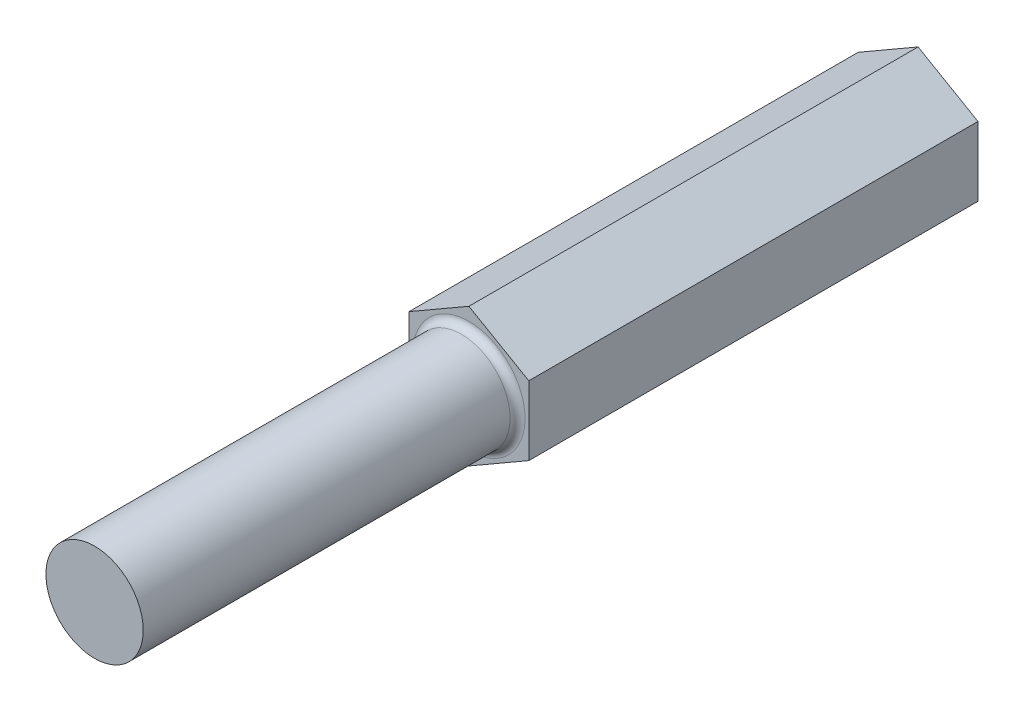
ISO-10303-21;
HEADER;
FILE_DESCRIPTION(('STEP AP214'),'2;1');
FILE_NAME('part.step','',(''),(''),'','','');
FILE_SCHEMA(('AUTOMOTIVE_DESIGN { 1 0 10303 214 1 1 1 1 }'));
ENDSEC;
DATA;
#1=APPLICATION_CONTEXT('core data for automotive mechanical design processes');
#2=APPLICATION_PROTOCOL_DEFINITION('international standard','automotive_design',2000,#1);
#3=PRODUCT_CONTEXT('',#1,'mechanical');
#4=PRODUCT('Part','Part','',(#3));
#5=PRODUCT_RELATED_PRODUCT_CATEGORY('part','',(#4));
#6=PRODUCT_DEFINITION_FORMATION('','',#4);
#7=PRODUCT_DEFINITION_CONTEXT('part definition',#1,'design');
#8=PRODUCT_DEFINITION('design','',#6,#7);
#9=PRODUCT_DEFINITION_SHAPE('','',#8);
#10=(LENGTH_UNIT() NAMED_UNIT(*) SI_UNIT(.MILLI.,.METRE.));
#11=(NAMED_UNIT(*) PLANE_ANGLE_UNIT() SI_UNIT($,.RADIAN.));
#12=(NAMED_UNIT(*) SI_UNIT($,.STERADIAN.) SOLID_ANGLE_UNIT());
#13=UNCERTAINTY_MEASURE_WITH_UNIT(LENGTH_MEASURE(1.E-05),#10,'distance_accuracy_value','');
#14=(GEOMETRIC_REPRESENTATION_CONTEXT(3) GLOBAL_UNCERTAINTY_ASSIGNED_CONTEXT((#13)) GLOBAL_UNIT_ASSIGNED_CONTEXT((#10,
#11,#12)) REPRESENTATION_CONTEXT('',''));
#15=CARTESIAN_POINT('',(0.,0.,0.));
#16=DIRECTION('',(0.,0.,1.));
#17=DIRECTION('',(1.,0.,0.));
#18=AXIS2_PLACEMENT_3D('',#15,#16,#17);
#19=CARTESIAN_POINT('',(0.,4.61880215351701,30.));
#20=DIRECTION('',(0.5,-0.866025403784438,0.));
#21=DIRECTION('',(0.866025403784439,0.5,0.));
#22=AXIS2_PLACEMENT_3D('',#19,#20,#21);
#23=PLANE('',#22);
#24=DIRECTION('',(-0.866025403784438,-0.5,0.));
#25=VECTOR('',#24,1.);
#26=CARTESIAN_POINT('',(0.,4.61880215351701,0.));
#27=LINE('',#26,#25);
#28=CARTESIAN_POINT('',(0.,4.61880215351701,0.));
#29=VERTEX_POINT('',#28);
#30=CARTESIAN_POINT('',(-4.,2.3094010767585,0.));
#31=VERTEX_POINT('',#30);
#32=EDGE_CURVE('E119',#29,#31,#27,.T.);
#33=ORIENTED_EDGE('',*,*,#32,.T.);
#34=DIRECTION('',(0.,0.,-1.));
#35=VECTOR('',#34,1.);
#36=CARTESIAN_POINT('',(-4.,2.3094010767585,30.));
#37=LINE('',#36,#35);
#38=CARTESIAN_POINT('',(-4.,2.3094010767585,30.));
#39=VERTEX_POINT('',#38);
#40=EDGE_CURVE('E137',#39,#31,#37,.T.);
#41=ORIENTED_EDGE('',*,*,#40,.F.);
#42=DIRECTION('',(-0.866025403784438,-0.5,0.));
#43=VECTOR('',#42,1.);
#44=CARTESIAN_POINT('',(0.,4.61880215351701,30.));
#45=LINE('',#44,#43);
#46=CARTESIAN_POINT('',(0.,4.61880215351701,30.));
#47=VERTEX_POINT('',#46);
#48=EDGE_CURVE('E130',#47,#39,#45,.T.);
#49=ORIENTED_EDGE('',*,*,#48,.F.);
#50=DIRECTION('',(0.,0.,-1.));
#51=VECTOR('',#50,1.);
#52=CARTESIAN_POINT('',(0.,4.61880215351701,30.));
#53=LINE('',#52,#51);
#54=EDGE_CURVE('E115',#47,#29,#53,.T.);
#55=ORIENTED_EDGE('',*,*,#54,.T.);
#56=EDGE_LOOP('',(#33,#41,#49,#55));
#57=FACE_BOUND('',#56,.T.);
#58=ADVANCED_FACE('F33',(#57),#23,.F.);
#59=CARTESIAN_POINT('',(-4.,2.3094010767585,30.));
#60=DIRECTION('',(1.,0.,0.));
#61=DIRECTION('',(0.,0.,-1.));
#62=AXIS2_PLACEMENT_3D('',#59,#60,#61);
#63=PLANE('',#62);
#64=DIRECTION('',(0.,-1.,0.));
#65=VECTOR('',#64,1.);
#66=CARTESIAN_POINT('',(-4.,2.3094010767585,0.));
#67=LINE('',#66,#65);
#68=CARTESIAN_POINT('',(-4.,-2.3094010767585,0.));
#69=VERTEX_POINT('',#68);
#70=EDGE_CURVE('E122',#31,#69,#67,.T.);
#71=ORIENTED_EDGE('',*,*,#70,.T.);
#72=DIRECTION('',(0.,0.,-1.));
#73=VECTOR('',#72,1.);
#74=CARTESIAN_POINT('',(-4.,-2.3094010767585,30.));
#75=LINE('',#74,#73);
#76=CARTESIAN_POINT('',(-4.,-2.3094010767585,30.));
#77=VERTEX_POINT('',#76);
#78=EDGE_CURVE('E134',#77,#69,#75,.T.);
#79=ORIENTED_EDGE('',*,*,#78,.F.);
#80=DIRECTION('',(0.,-1.,0.));
#81=VECTOR('',#80,1.);
#82=CARTESIAN_POINT('',(-4.,2.3094010767585,30.));
#83=LINE('',#82,#81);
#84=EDGE_CURVE('E88',#39,#77,#83,.T.);
#85=ORIENTED_EDGE('',*,*,#84,.F.);
#86=ORIENTED_EDGE('',*,*,#40,.T.);
#87=EDGE_LOOP('',(#71,#79,#85,#86));
#88=FACE_BOUND('',#87,.T.);
#89=ADVANCED_FACE('F154',(#88),#63,.F.);
#90=CARTESIAN_POINT('',(-4.,-2.3094010767585,30.));
#91=DIRECTION('',(0.5,0.866025403784439,0.));
#92=DIRECTION('',(-0.866025403784439,0.5,0.));
#93=AXIS2_PLACEMENT_3D('',#90,#91,#92);
#94=PLANE('',#93);
#95=DIRECTION('',(0.866025403784439,-0.5,0.));
#96=VECTOR('',#95,1.);
#97=CARTESIAN_POINT('',(-4.,-2.3094010767585,0.));
#98=LINE('',#97,#96);
#99=CARTESIAN_POINT('',(0.,-4.61880215351701,0.));
#100=VERTEX_POINT('',#99);
#101=EDGE_CURVE('E125',#69,#100,#98,.T.);
#102=ORIENTED_EDGE('',*,*,#101,.T.);
#103=DIRECTION('',(0.,0.,-1.));
#104=VECTOR('',#103,1.);
#105=CARTESIAN_POINT('',(0.,-4.61880215351701,30.));
#106=LINE('',#105,#104);
#107=CARTESIAN_POINT('',(0.,-4.61880215351701,30.));
#108=VERTEX_POINT('',#107);
#109=EDGE_CURVE('E110',#108,#100,#106,.T.);
#110=ORIENTED_EDGE('',*,*,#109,.F.);
#111=DIRECTION('',(0.866025403784439,-0.5,0.));
#112=VECTOR('',#111,1.);
#113=CARTESIAN_POINT('',(-4.,-2.3094010767585,30.));
#114=LINE('',#113,#112);
#115=EDGE_CURVE('E101',#77,#108,#114,.T.);
#116=ORIENTED_EDGE('',*,*,#115,.F.);
#117=ORIENTED_EDGE('',*,*,#78,.T.);
#118=EDGE_LOOP('',(#102,#110,#116,#117));
#119=FACE_BOUND('',#118,.T.);
#120=ADVANCED_FACE('F159',(#119),#94,.F.);
#121=CARTESIAN_POINT('',(0.,-4.61880215351701,30.));
#122=DIRECTION('',(-0.5,0.866025403784438,0.));
#123=DIRECTION('',(-0.866025403784439,-0.5,0.));
#124=AXIS2_PLACEMENT_3D('',#121,#122,#123);
#125=PLANE('',#124);
#126=DIRECTION('',(0.866025403784438,0.5,0.));
#127=VECTOR('',#126,1.);
#128=CARTESIAN_POINT('',(0.,-4.61880215351701,0.));
#129=LINE('',#128,#127);
#130=CARTESIAN_POINT('',(4.,-2.3094010767585,0.));
#131=VERTEX_POINT('',#130);
#132=EDGE_CURVE('E109',#100,#131,#129,.T.);
#133=ORIENTED_EDGE('',*,*,#132,.T.);
#134=DIRECTION('',(0.,0.,-1.));
#135=VECTOR('',#134,1.);
#136=CARTESIAN_POINT('',(4.,-2.3094010767585,30.));
#137=LINE('',#136,#135);
#138=CARTESIAN_POINT('',(4.,-2.3094010767585,30.));
#139=VERTEX_POINT('',#138);
#140=EDGE_CURVE('E106',#139,#131,#137,.T.);
#141=ORIENTED_EDGE('',*,*,#140,.F.);
#142=DIRECTION('',(0.866025403784438,0.5,0.));
#143=VECTOR('',#142,1.);
#144=CARTESIAN_POINT('',(0.,-4.61880215351701,30.));
#145=LINE('',#144,#143);
#146=EDGE_CURVE('E95',#108,#139,#145,.T.);
#147=ORIENTED_EDGE('',*,*,#146,.F.);
#148=ORIENTED_EDGE('',*,*,#109,.T.);
#149=EDGE_LOOP('',(#133,#141,#147,#148));
#150=FACE_BOUND('',#149,.T.);
#151=ADVANCED_FACE('F107',(#150),#125,.F.);
#152=CARTESIAN_POINT('',(4.,-2.3094010767585,30.));
#153=DIRECTION('',(-1.,0.,0.));
#154=DIRECTION('',(0.,-1.,0.));
#155=AXIS2_PLACEMENT_3D('',#152,#153,#154);
#156=PLANE('',#155);
#157=DIRECTION('',(0.,1.,0.));
#158=VECTOR('',#157,1.);
#159=CARTESIAN_POINT('',(4.,-2.3094010767585,0.));
#160=LINE('',#159,#158);
#161=CARTESIAN_POINT('',(4.,2.3094010767585,0.));
#162=VERTEX_POINT('',#161);
#163=EDGE_CURVE('E73',#131,#162,#160,.T.);
#164=ORIENTED_EDGE('',*,*,#163,.T.);
#165=DIRECTION('',(0.,0.,-1.));
#166=VECTOR('',#165,1.);
#167=CARTESIAN_POINT('',(4.,2.3094010767585,30.));
#168=LINE('',#167,#166);
#169=CARTESIAN_POINT('',(4.,2.3094010767585,30.));
#170=VERTEX_POINT('',#169);
#171=EDGE_CURVE('E111',#170,#162,#168,.T.);
#172=ORIENTED_EDGE('',*,*,#171,.F.);
#173=DIRECTION('',(0.,1.,0.));
#174=VECTOR('',#173,1.);
#175=CARTESIAN_POINT('',(4.,-2.3094010767585,30.));
#176=LINE('',#175,#174);
#177=EDGE_CURVE('E99',#139,#170,#176,.T.);
#178=ORIENTED_EDGE('',*,*,#177,.F.);
#179=ORIENTED_EDGE('',*,*,#140,.T.);
#180=EDGE_LOOP('',(#164,#172,#178,#179));
#181=FACE_BOUND('',#180,.T.);
#182=ADVANCED_FACE('F113',(#181),#156,.F.);
#183=CARTESIAN_POINT('',(4.,2.3094010767585,30.));
#184=DIRECTION('',(-0.5,-0.866025403784439,0.));
#185=DIRECTION('',(0.866025403784439,-0.5,0.));
#186=AXIS2_PLACEMENT_3D('',#183,#184,#185);
#187=PLANE('',#186);
#188=DIRECTION('',(-0.866025403784439,0.5,0.));
#189=VECTOR('',#188,1.);
#190=CARTESIAN_POINT('',(4.,2.3094010767585,0.));
#191=LINE('',#190,#189);
#192=EDGE_CURVE('E79',#162,#29,#191,.T.);
#193=ORIENTED_EDGE('',*,*,#192,.T.);
#194=ORIENTED_EDGE('',*,*,#54,.F.);
#195=DIRECTION('',(-0.866025403784439,0.5,0.));
#196=VECTOR('',#195,1.);
#197=CARTESIAN_POINT('',(4.,2.3094010767585,30.));
#198=LINE('',#197,#196);
#199=EDGE_CURVE('E50',#170,#47,#198,.T.);
#200=ORIENTED_EDGE('',*,*,#199,.F.);
#201=ORIENTED_EDGE('',*,*,#171,.T.);
#202=EDGE_LOOP('',(#193,#194,#200,#201));
#203=FACE_BOUND('',#202,.T.);
#204=ADVANCED_FACE('F169',(#203),#187,.F.);
#205=CARTESIAN_POINT('',(0.,0.,30.));
#206=DIRECTION('',(0.,0.,1.));
#207=DIRECTION('',(1.,0.,0.));
#208=AXIS2_PLACEMENT_3D('',#205,#206,#207);
#209=PLANE('',#208);
#210=CARTESIAN_POINT('',(0.,0.,30.));
#211=DIRECTION('',(0.,0.,1.));
#212=DIRECTION('',(1.,0.,0.));
#213=AXIS2_PLACEMENT_3D('',#210,#211,#212);
#214=CIRCLE('',#213,3.75);
#215=CARTESIAN_POINT('',(3.75,0.,30.));
#216=VERTEX_POINT('',#215);
#217=EDGE_CURVE('E11',#216,#216,#214,.F.);
#218=ORIENTED_EDGE('',*,*,#217,.T.);
#219=EDGE_LOOP('',(#218));
#220=FACE_BOUND('',#219,.T.);
#221=ORIENTED_EDGE('',*,*,#48,.T.);
#222=ORIENTED_EDGE('',*,*,#84,.T.);
#223=ORIENTED_EDGE('',*,*,#115,.T.);
#224=ORIENTED_EDGE('',*,*,#146,.T.);
#225=ORIENTED_EDGE('',*,*,#177,.T.);
#226=ORIENTED_EDGE('',*,*,#199,.T.);
#227=EDGE_LOOP('',(#221,#222,#223,#224,#225,#226));
#228=FACE_BOUND('',#227,.T.);
#229=ADVANCED_FACE('F97',(#220,#228),#209,.T.);
#230=CARTESIAN_POINT('',(0.,0.,0.));
#231=DIRECTION('',(0.,0.,1.));
#232=DIRECTION('',(1.,0.,0.));
#233=AXIS2_PLACEMENT_3D('',#230,#231,#232);
#234=PLANE('',#233);
#235=ORIENTED_EDGE('',*,*,#32,.F.);
#236=ORIENTED_EDGE('',*,*,#192,.F.);
#237=ORIENTED_EDGE('',*,*,#163,.F.);
#238=ORIENTED_EDGE('',*,*,#132,.F.);
#239=ORIENTED_EDGE('',*,*,#101,.F.);
#240=ORIENTED_EDGE('',*,*,#70,.F.);
#241=EDGE_LOOP('',(#235,#236,#237,#238,#239,#240));
#242=FACE_BOUND('',#241,.T.);
#243=ADVANCED_FACE('F172',(#242),#234,.F.);
#244=CARTESIAN_POINT('',(0.,0.,55.));
#245=DIRECTION('',(0.,0.,-1.));
#246=DIRECTION('',(-1.,0.,0.));
#247=AXIS2_PLACEMENT_3D('',#244,#245,#246);
#248=CYLINDRICAL_SURFACE('',#247,3.25);
#249=CARTESIAN_POINT('',(0.,0.,30.5));
#250=DIRECTION('',(0.,0.,1.));
#251=DIRECTION('',(1.,0.,0.));
#252=AXIS2_PLACEMENT_3D('',#249,#250,#251);
#253=CIRCLE('',#252,3.25);
#254=CARTESIAN_POINT('',(3.25,0.,30.5));
#255=VERTEX_POINT('',#254);
#256=EDGE_CURVE('E42',#255,#255,#253,.T.);
#257=ORIENTED_EDGE('',*,*,#256,.T.);
#258=EDGE_LOOP('',(#257));
#259=FACE_BOUND('',#258,.T.);
#260=CARTESIAN_POINT('',(0.,0.,55.));
#261=DIRECTION('',(0.,0.,1.));
#262=DIRECTION('',(1.,0.,0.));
#263=AXIS2_PLACEMENT_3D('',#260,#261,#262);
#264=CIRCLE('',#263,3.25);
#265=CARTESIAN_POINT('',(3.25,0.,55.));
#266=VERTEX_POINT('',#265);
#267=EDGE_CURVE('E123',#266,#266,#264,.T.);
#268=ORIENTED_EDGE('',*,*,#267,.F.);
#269=EDGE_LOOP('',(#268));
#270=FACE_BOUND('',#269,.T.);
#271=ADVANCED_FACE('F141',(#259,#270),#248,.T.);
#272=CARTESIAN_POINT('',(0.,0.,55.));
#273=DIRECTION('',(0.,0.,1.));
#274=DIRECTION('',(1.,0.,0.));
#275=AXIS2_PLACEMENT_3D('',#272,#273,#274);
#276=PLANE('',#275);
#277=ORIENTED_EDGE('',*,*,#267,.T.);
#278=EDGE_LOOP('',(#277));
#279=FACE_BOUND('',#278,.T.);
#280=ADVANCED_FACE('F145',(#279),#276,.T.);
#281=CARTESIAN_POINT('',(0.,0.,30.5));
#282=DIRECTION('',(0.,0.,1.));
#283=DIRECTION('',(1.,0.,0.));
#284=AXIS2_PLACEMENT_3D('',#281,#282,#283);
#285=TOROIDAL_SURFACE('',#284,3.75,0.5);
#286=ORIENTED_EDGE('',*,*,#217,.F.);
#287=EDGE_LOOP('',(#286));
#288=FACE_BOUND('',#287,.T.);
#289=ORIENTED_EDGE('',*,*,#256,.F.);
#290=EDGE_LOOP('',(#289));
#291=FACE_BOUND('',#290,.T.);
#292=ADVANCED_FACE('F35',(#288,#291),#285,.F.);
#293=CLOSED_SHELL('',(#58,#89,#120,#151,#182,#204,#229,#243,#271,#280,#292));
#294=MANIFOLD_SOLID_BREP('B2',#293);
#295=ADVANCED_BREP_SHAPE_REPRESENTATION('',(#18,#294),#14);
#296=SHAPE_DEFINITION_REPRESENTATION(#9,#295);
ENDSEC;
END-ISO-10303-21;
